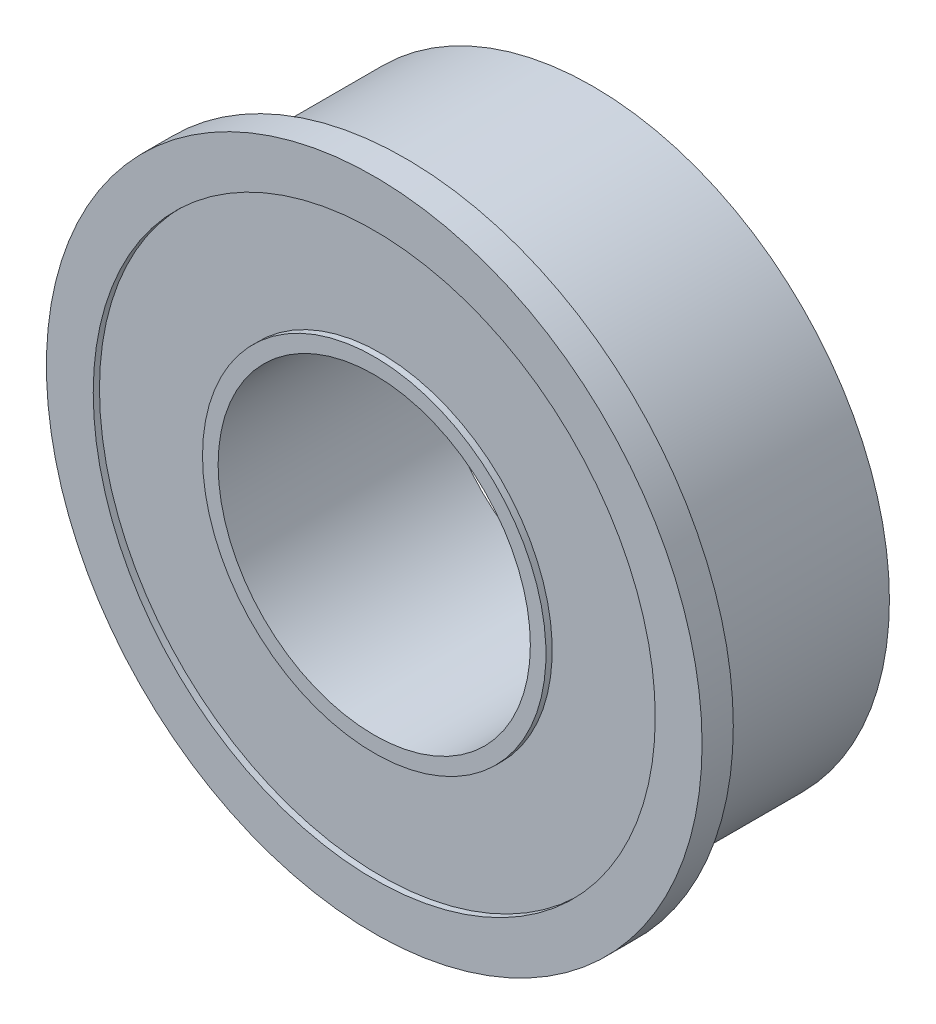
ISO-10303-21;
HEADER;
FILE_DESCRIPTION(('STEP AP214'),'2;1');
FILE_NAME('part.step','',(''),(''),'','','');
FILE_SCHEMA(('AUTOMOTIVE_DESIGN { 1 0 10303 214 1 1 1 1 }'));
ENDSEC;
DATA;
#1=APPLICATION_CONTEXT('core data for automotive mechanical design processes');
#2=APPLICATION_PROTOCOL_DEFINITION('international standard','automotive_design',2000,#1);
#3=PRODUCT_CONTEXT('',#1,'mechanical');
#4=PRODUCT('Part','Part','',(#3));
#5=PRODUCT_RELATED_PRODUCT_CATEGORY('part','',(#4));
#6=PRODUCT_DEFINITION_FORMATION('','',#4);
#7=PRODUCT_DEFINITION_CONTEXT('part definition',#1,'design');
#8=PRODUCT_DEFINITION('design','',#6,#7);
#9=PRODUCT_DEFINITION_SHAPE('','',#8);
#10=(LENGTH_UNIT() NAMED_UNIT(*) SI_UNIT(.MILLI.,.METRE.));
#11=(NAMED_UNIT(*) PLANE_ANGLE_UNIT() SI_UNIT($,.RADIAN.));
#12=(NAMED_UNIT(*) SI_UNIT($,.STERADIAN.) SOLID_ANGLE_UNIT());
#13=UNCERTAINTY_MEASURE_WITH_UNIT(LENGTH_MEASURE(1.E-05),#10,'distance_accuracy_value','');
#14=(GEOMETRIC_REPRESENTATION_CONTEXT(3) GLOBAL_UNCERTAINTY_ASSIGNED_CONTEXT((#13)) GLOBAL_UNIT_ASSIGNED_CONTEXT((#10,
#11,#12)) REPRESENTATION_CONTEXT('',''));
#15=CARTESIAN_POINT('',(0.,0.,0.));
#16=DIRECTION('',(0.,0.,1.));
#17=DIRECTION('',(1.,0.,0.));
#18=AXIS2_PLACEMENT_3D('',#15,#16,#17);
#19=CARTESIAN_POINT('',(0.,0.,1.));
#20=DIRECTION('',(0.,0.,1.));
#21=DIRECTION('',(1.,0.,0.));
#22=AXIS2_PLACEMENT_3D('',#19,#20,#21);
#23=PLANE('',#22);
#24=CARTESIAN_POINT('',(0.,0.,1.));
#25=DIRECTION('',(0.,0.,1.));
#26=DIRECTION('',(1.,0.,0.));
#27=AXIS2_PLACEMENT_3D('',#24,#25,#26);
#28=CIRCLE('',#27,5.);
#29=CARTESIAN_POINT('',(5.,0.,1.));
#30=VERTEX_POINT('',#29);
#31=EDGE_CURVE('E58',#30,#30,#28,.T.);
#32=ORIENTED_EDGE('',*,*,#31,.F.);
#33=EDGE_LOOP('',(#32));
#34=FACE_BOUND('',#33,.T.);
#35=CARTESIAN_POINT('',(0.,0.,1.));
#36=DIRECTION('',(0.,0.,-1.));
#37=DIRECTION('',(-1.,0.,0.));
#38=AXIS2_PLACEMENT_3D('',#35,#36,#37);
#39=CIRCLE('',#38,5.5);
#40=CARTESIAN_POINT('',(-5.5,0.,1.));
#41=VERTEX_POINT('',#40);
#42=EDGE_CURVE('E82',#41,#41,#39,.T.);
#43=ORIENTED_EDGE('',*,*,#42,.F.);
#44=EDGE_LOOP('',(#43));
#45=FACE_BOUND('',#44,.T.);
#46=ADVANCED_FACE('F39',(#34,#45),#23,.T.);
#47=CARTESIAN_POINT('',(0.,0.,-6.));
#48=DIRECTION('',(0.,0.,1.));
#49=DIRECTION('',(1.,0.,0.));
#50=AXIS2_PLACEMENT_3D('',#47,#48,#49);
#51=PLANE('',#50);
#52=CARTESIAN_POINT('',(0.,0.,-6.));
#53=DIRECTION('',(0.,0.,1.));
#54=DIRECTION('',(1.,0.,0.));
#55=AXIS2_PLACEMENT_3D('',#52,#53,#54);
#56=CIRCLE('',#55,5.);
#57=CARTESIAN_POINT('',(5.,0.,-6.));
#58=VERTEX_POINT('',#57);
#59=EDGE_CURVE('E57',#58,#58,#56,.T.);
#60=ORIENTED_EDGE('',*,*,#59,.T.);
#61=EDGE_LOOP('',(#60));
#62=FACE_BOUND('',#61,.T.);
#63=CARTESIAN_POINT('',(0.,0.,-6.));
#64=DIRECTION('',(0.,0.,-1.));
#65=DIRECTION('',(-1.,0.,0.));
#66=AXIS2_PLACEMENT_3D('',#63,#64,#65);
#67=CIRCLE('',#66,5.5);
#68=CARTESIAN_POINT('',(-5.5,0.,-6.));
#69=VERTEX_POINT('',#68);
#70=EDGE_CURVE('E70',#69,#69,#67,.T.);
#71=ORIENTED_EDGE('',*,*,#70,.T.);
#72=EDGE_LOOP('',(#71));
#73=FACE_BOUND('',#72,.T.);
#74=ADVANCED_FACE('F98',(#62,#73),#51,.F.);
#75=CARTESIAN_POINT('',(0.,0.,1.));
#76=DIRECTION('',(0.,0.,-1.));
#77=DIRECTION('',(-1.,0.,0.));
#78=AXIS2_PLACEMENT_3D('',#75,#76,#77);
#79=CIRCLE('',#78,9.);
#80=CARTESIAN_POINT('',(-9.,0.,1.));
#81=VERTEX_POINT('',#80);
#82=EDGE_CURVE('E76',#81,#81,#79,.T.);
#83=ORIENTED_EDGE('',*,*,#82,.T.);
#84=EDGE_LOOP('',(#83));
#85=FACE_BOUND('',#84,.T.);
#86=CARTESIAN_POINT('',(0.,0.,1.));
#87=DIRECTION('',(0.,0.,1.));
#88=DIRECTION('',(1.,0.,0.));
#89=AXIS2_PLACEMENT_3D('',#86,#87,#88);
#90=CIRCLE('',#89,10.5);
#91=CARTESIAN_POINT('',(10.5,0.,1.));
#92=VERTEX_POINT('',#91);
#93=EDGE_CURVE('E10',#92,#92,#90,.T.);
#94=ORIENTED_EDGE('',*,*,#93,.T.);
#95=EDGE_LOOP('',(#94));
#96=FACE_BOUND('',#95,.T.);
#97=ADVANCED_FACE('F101',(#85,#96),#23,.T.);
#98=CARTESIAN_POINT('',(0.,0.,0.));
#99=DIRECTION('',(0.,0.,1.));
#100=DIRECTION('',(1.,0.,0.));
#101=AXIS2_PLACEMENT_3D('',#98,#99,#100);
#102=PLANE('',#101);
#103=CARTESIAN_POINT('',(0.,0.,0.));
#104=DIRECTION('',(0.,0.,1.));
#105=DIRECTION('',(1.,0.,0.));
#106=AXIS2_PLACEMENT_3D('',#103,#104,#105);
#107=CIRCLE('',#106,10.5);
#108=CARTESIAN_POINT('',(10.5,0.,0.));
#109=VERTEX_POINT('',#108);
#110=EDGE_CURVE('E43',#109,#109,#107,.T.);
#111=ORIENTED_EDGE('',*,*,#110,.F.);
#112=EDGE_LOOP('',(#111));
#113=FACE_BOUND('',#112,.T.);
#114=CARTESIAN_POINT('',(0.,0.,0.));
#115=DIRECTION('',(0.,0.,1.));
#116=DIRECTION('',(1.,0.,0.));
#117=AXIS2_PLACEMENT_3D('',#114,#115,#116);
#118=CIRCLE('',#117,9.5);
#119=CARTESIAN_POINT('',(9.5,0.,0.));
#120=VERTEX_POINT('',#119);
#121=EDGE_CURVE('E50',#120,#120,#118,.T.);
#122=ORIENTED_EDGE('',*,*,#121,.T.);
#123=EDGE_LOOP('',(#122));
#124=FACE_BOUND('',#123,.T.);
#125=ADVANCED_FACE('F111',(#113,#124),#102,.F.);
#126=CARTESIAN_POINT('',(0.,0.,1.));
#127=DIRECTION('',(0.,0.,-1.));
#128=DIRECTION('',(-1.,0.,0.));
#129=AXIS2_PLACEMENT_3D('',#126,#127,#128);
#130=CYLINDRICAL_SURFACE('',#129,10.5);
#131=ORIENTED_EDGE('',*,*,#93,.F.);
#132=EDGE_LOOP('',(#131));
#133=FACE_BOUND('',#132,.T.);
#134=ORIENTED_EDGE('',*,*,#110,.T.);
#135=EDGE_LOOP('',(#134));
#136=FACE_BOUND('',#135,.T.);
#137=ADVANCED_FACE('F41',(#133,#136),#130,.T.);
#138=CARTESIAN_POINT('',(0.,0.,-6.));
#139=DIRECTION('',(0.,0.,1.));
#140=DIRECTION('',(1.,0.,0.));
#141=AXIS2_PLACEMENT_3D('',#138,#139,#140);
#142=CYLINDRICAL_SURFACE('',#141,9.5);
#143=CARTESIAN_POINT('',(0.,0.,-6.));
#144=DIRECTION('',(0.,0.,1.));
#145=DIRECTION('',(1.,0.,0.));
#146=AXIS2_PLACEMENT_3D('',#143,#144,#145);
#147=CIRCLE('',#146,9.5);
#148=CARTESIAN_POINT('',(9.5,0.,-6.));
#149=VERTEX_POINT('',#148);
#150=EDGE_CURVE('E54',#149,#149,#147,.T.);
#151=ORIENTED_EDGE('',*,*,#150,.T.);
#152=EDGE_LOOP('',(#151));
#153=FACE_BOUND('',#152,.T.);
#154=ORIENTED_EDGE('',*,*,#121,.F.);
#155=EDGE_LOOP('',(#154));
#156=FACE_BOUND('',#155,.T.);
#157=ADVANCED_FACE('F144',(#153,#156),#142,.T.);
#158=CARTESIAN_POINT('',(0.,0.,-6.));
#159=DIRECTION('',(0.,0.,-1.));
#160=DIRECTION('',(-1.,0.,0.));
#161=AXIS2_PLACEMENT_3D('',#158,#159,#160);
#162=CIRCLE('',#161,9.);
#163=CARTESIAN_POINT('',(-9.,0.,-6.));
#164=VERTEX_POINT('',#163);
#165=EDGE_CURVE('E64',#164,#164,#162,.T.);
#166=ORIENTED_EDGE('',*,*,#165,.F.);
#167=EDGE_LOOP('',(#166));
#168=FACE_BOUND('',#167,.T.);
#169=ORIENTED_EDGE('',*,*,#150,.F.);
#170=EDGE_LOOP('',(#169));
#171=FACE_BOUND('',#170,.T.);
#172=ADVANCED_FACE('F107',(#168,#171),#51,.F.);
#173=CARTESIAN_POINT('',(0.,0.,-6.));
#174=DIRECTION('',(0.,0.,1.));
#175=DIRECTION('',(1.,0.,0.));
#176=AXIS2_PLACEMENT_3D('',#173,#174,#175);
#177=CYLINDRICAL_SURFACE('',#176,5.);
#178=ORIENTED_EDGE('',*,*,#59,.F.);
#179=EDGE_LOOP('',(#178));
#180=FACE_BOUND('',#179,.T.);
#181=ORIENTED_EDGE('',*,*,#31,.T.);
#182=EDGE_LOOP('',(#181));
#183=FACE_BOUND('',#182,.T.);
#184=ADVANCED_FACE('F139',(#180,#183),#177,.F.);
#185=CARTESIAN_POINT('',(0.,0.,-5.8));
#186=DIRECTION('',(0.,0.,-1.));
#187=DIRECTION('',(-1.,0.,0.));
#188=AXIS2_PLACEMENT_3D('',#185,#186,#187);
#189=CYLINDRICAL_SURFACE('',#188,9.);
#190=CARTESIAN_POINT('',(0.,0.,-5.8));
#191=DIRECTION('',(0.,0.,-1.));
#192=DIRECTION('',(-1.,0.,0.));
#193=AXIS2_PLACEMENT_3D('',#190,#191,#192);
#194=CIRCLE('',#193,9.);
#195=CARTESIAN_POINT('',(-9.,0.,-5.8));
#196=VERTEX_POINT('',#195);
#197=EDGE_CURVE('E61',#196,#196,#194,.T.);
#198=ORIENTED_EDGE('',*,*,#197,.F.);
#199=EDGE_LOOP('',(#198));
#200=FACE_BOUND('',#199,.T.);
#201=ORIENTED_EDGE('',*,*,#165,.T.);
#202=EDGE_LOOP('',(#201));
#203=FACE_BOUND('',#202,.T.);
#204=ADVANCED_FACE('F135',(#200,#203),#189,.F.);
#205=CARTESIAN_POINT('',(0.,0.,-5.8));
#206=DIRECTION('',(0.,0.,-1.));
#207=DIRECTION('',(-1.,0.,0.));
#208=AXIS2_PLACEMENT_3D('',#205,#206,#207);
#209=PLANE('',#208);
#210=CARTESIAN_POINT('',(0.,0.,-5.8));
#211=DIRECTION('',(0.,0.,-1.));
#212=DIRECTION('',(-1.,0.,0.));
#213=AXIS2_PLACEMENT_3D('',#210,#211,#212);
#214=CIRCLE('',#213,5.5);
#215=CARTESIAN_POINT('',(-5.5,0.,-5.8));
#216=VERTEX_POINT('',#215);
#217=EDGE_CURVE('E67',#216,#216,#214,.T.);
#218=ORIENTED_EDGE('',*,*,#217,.F.);
#219=EDGE_LOOP('',(#218));
#220=FACE_BOUND('',#219,.T.);
#221=ORIENTED_EDGE('',*,*,#197,.T.);
#222=EDGE_LOOP('',(#221));
#223=FACE_BOUND('',#222,.T.);
#224=ADVANCED_FACE('F131',(#220,#223),#209,.T.);
#225=CARTESIAN_POINT('',(0.,0.,-5.8));
#226=DIRECTION('',(0.,0.,-1.));
#227=DIRECTION('',(-1.,0.,0.));
#228=AXIS2_PLACEMENT_3D('',#225,#226,#227);
#229=CYLINDRICAL_SURFACE('',#228,5.5);
#230=ORIENTED_EDGE('',*,*,#217,.T.);
#231=EDGE_LOOP('',(#230));
#232=FACE_BOUND('',#231,.T.);
#233=ORIENTED_EDGE('',*,*,#70,.F.);
#234=EDGE_LOOP('',(#233));
#235=FACE_BOUND('',#234,.T.);
#236=ADVANCED_FACE('F125',(#232,#235),#229,.T.);
#237=CARTESIAN_POINT('',(0.,0.,0.8));
#238=DIRECTION('',(0.,0.,1.));
#239=DIRECTION('',(-1.,0.,0.));
#240=AXIS2_PLACEMENT_3D('',#237,#238,#239);
#241=PLANE('',#240);
#242=CARTESIAN_POINT('',(0.,0.,0.8));
#243=DIRECTION('',(0.,0.,-1.));
#244=DIRECTION('',(-1.,0.,0.));
#245=AXIS2_PLACEMENT_3D('',#242,#243,#244);
#246=CIRCLE('',#245,9.);
#247=CARTESIAN_POINT('',(-9.,0.,0.8));
#248=VERTEX_POINT('',#247);
#249=EDGE_CURVE('E73',#248,#248,#246,.T.);
#250=ORIENTED_EDGE('',*,*,#249,.F.);
#251=EDGE_LOOP('',(#250));
#252=FACE_BOUND('',#251,.T.);
#253=CARTESIAN_POINT('',(0.,0.,0.8));
#254=DIRECTION('',(0.,0.,-1.));
#255=DIRECTION('',(-1.,0.,0.));
#256=AXIS2_PLACEMENT_3D('',#253,#254,#255);
#257=CIRCLE('',#256,5.5);
#258=CARTESIAN_POINT('',(-5.5,0.,0.8));
#259=VERTEX_POINT('',#258);
#260=EDGE_CURVE('E79',#259,#259,#257,.T.);
#261=ORIENTED_EDGE('',*,*,#260,.T.);
#262=EDGE_LOOP('',(#261));
#263=FACE_BOUND('',#262,.T.);
#264=ADVANCED_FACE('F88',(#252,#263),#241,.T.);
#265=CARTESIAN_POINT('',(0.,0.,0.8));
#266=DIRECTION('',(0.,0.,1.));
#267=DIRECTION('',(1.,0.,0.));
#268=AXIS2_PLACEMENT_3D('',#265,#266,#267);
#269=CYLINDRICAL_SURFACE('',#268,9.);
#270=ORIENTED_EDGE('',*,*,#249,.T.);
#271=EDGE_LOOP('',(#270));
#272=FACE_BOUND('',#271,.T.);
#273=ORIENTED_EDGE('',*,*,#82,.F.);
#274=EDGE_LOOP('',(#273));
#275=FACE_BOUND('',#274,.T.);
#276=ADVANCED_FACE('F93',(#272,#275),#269,.F.);
#277=CARTESIAN_POINT('',(0.,0.,0.8));
#278=DIRECTION('',(0.,0.,1.));
#279=DIRECTION('',(1.,0.,0.));
#280=AXIS2_PLACEMENT_3D('',#277,#278,#279);
#281=CYLINDRICAL_SURFACE('',#280,5.5);
#282=ORIENTED_EDGE('',*,*,#260,.F.);
#283=EDGE_LOOP('',(#282));
#284=FACE_BOUND('',#283,.T.);
#285=ORIENTED_EDGE('',*,*,#42,.T.);
#286=EDGE_LOOP('',(#285));
#287=FACE_BOUND('',#286,.T.);
#288=ADVANCED_FACE('F90',(#284,#287),#281,.T.);
#289=CLOSED_SHELL('',(#46,#74,#97,#125,#137,#157,#172,#184,#204,#224,#236,#264,#276,#288));
#290=MANIFOLD_SOLID_BREP('B2',#289);
#291=ADVANCED_BREP_SHAPE_REPRESENTATION('',(#18,#290),#14);
#292=SHAPE_DEFINITION_REPRESENTATION(#9,#291);
ENDSEC;
END-ISO-10303-21;
